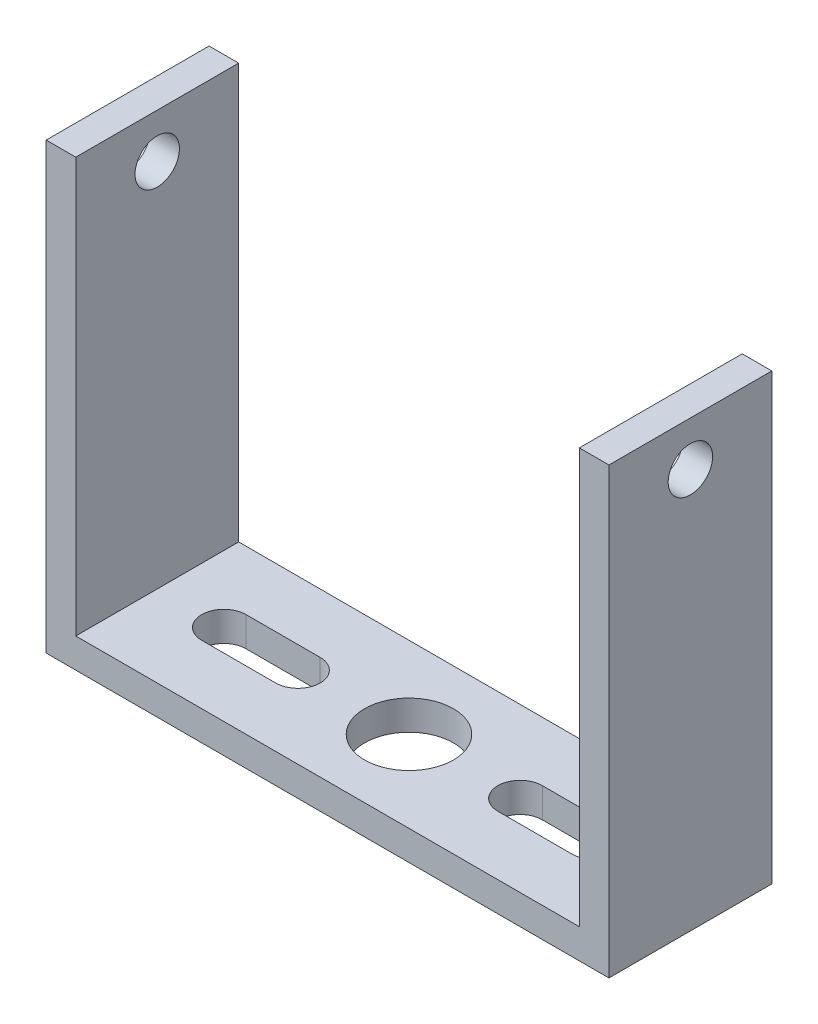
ISO-10303-21;
HEADER;
FILE_DESCRIPTION(('STEP AP214'),'2;1');
FILE_NAME('part.step','',(''),(''),'','','');
FILE_SCHEMA(('AUTOMOTIVE_DESIGN { 1 0 10303 214 1 1 1 1 }'));
ENDSEC;
DATA;
#1=APPLICATION_CONTEXT('core data for automotive mechanical design processes');
#2=APPLICATION_PROTOCOL_DEFINITION('international standard','automotive_design',2000,#1);
#3=PRODUCT_CONTEXT('',#1,'mechanical');
#4=PRODUCT('Part','Part','',(#3));
#5=PRODUCT_RELATED_PRODUCT_CATEGORY('part','',(#4));
#6=PRODUCT_DEFINITION_FORMATION('','',#4);
#7=PRODUCT_DEFINITION_CONTEXT('part definition',#1,'design');
#8=PRODUCT_DEFINITION('design','',#6,#7);
#9=PRODUCT_DEFINITION_SHAPE('','',#8);
#10=(LENGTH_UNIT() NAMED_UNIT(*) SI_UNIT(.MILLI.,.METRE.));
#11=(NAMED_UNIT(*) PLANE_ANGLE_UNIT() SI_UNIT($,.RADIAN.));
#12=(NAMED_UNIT(*) SI_UNIT($,.STERADIAN.) SOLID_ANGLE_UNIT());
#13=UNCERTAINTY_MEASURE_WITH_UNIT(LENGTH_MEASURE(1.E-05),#10,'distance_accuracy_value','');
#14=(GEOMETRIC_REPRESENTATION_CONTEXT(3) GLOBAL_UNCERTAINTY_ASSIGNED_CONTEXT((#13)) GLOBAL_UNIT_ASSIGNED_CONTEXT((#10,
#11,#12)) REPRESENTATION_CONTEXT('',''));
#15=CARTESIAN_POINT('',(0.,0.,0.));
#16=DIRECTION('',(0.,0.,1.));
#17=DIRECTION('',(1.,0.,0.));
#18=AXIS2_PLACEMENT_3D('',#15,#16,#17);
#19=CARTESIAN_POINT('',(2.00000000000001,30.,11.));
#20=DIRECTION('',(0.,-1.,0.));
#21=DIRECTION('',(1.,0.,0.));
#22=AXIS2_PLACEMENT_3D('',#19,#20,#21);
#23=PLANE('',#22);
#24=DIRECTION('',(-1.,0.,0.));
#25=VECTOR('',#24,1.);
#26=CARTESIAN_POINT('',(2.00000000000001,30.,0.));
#27=LINE('',#26,#25);
#28=CARTESIAN_POINT('',(2.00000000000001,30.,0.));
#29=VERTEX_POINT('',#28);
#30=CARTESIAN_POINT('',(0.,30.,0.));
#31=VERTEX_POINT('',#30);
#32=EDGE_CURVE('E212',#29,#31,#27,.T.);
#33=ORIENTED_EDGE('',*,*,#32,.T.);
#34=DIRECTION('',(0.,0.,-1.));
#35=VECTOR('',#34,1.);
#36=CARTESIAN_POINT('',(0.,30.,11.));
#37=LINE('',#36,#35);
#38=CARTESIAN_POINT('',(0.,30.,11.));
#39=VERTEX_POINT('',#38);
#40=EDGE_CURVE('E267',#39,#31,#37,.T.);
#41=ORIENTED_EDGE('',*,*,#40,.F.);
#42=DIRECTION('',(-1.,0.,0.));
#43=VECTOR('',#42,1.);
#44=CARTESIAN_POINT('',(2.00000000000001,30.,11.));
#45=LINE('',#44,#43);
#46=CARTESIAN_POINT('',(2.00000000000001,30.,11.));
#47=VERTEX_POINT('',#46);
#48=EDGE_CURVE('E213',#47,#39,#45,.T.);
#49=ORIENTED_EDGE('',*,*,#48,.F.);
#50=DIRECTION('',(0.,0.,-1.));
#51=VECTOR('',#50,1.);
#52=CARTESIAN_POINT('',(2.00000000000001,30.,11.));
#53=LINE('',#52,#51);
#54=EDGE_CURVE('E231',#47,#29,#53,.T.);
#55=ORIENTED_EDGE('',*,*,#54,.T.);
#56=EDGE_LOOP('',(#33,#41,#49,#55));
#57=FACE_BOUND('',#56,.T.);
#58=ADVANCED_FACE('F35',(#57),#23,.F.);
#59=CARTESIAN_POINT('',(0.,30.,11.));
#60=DIRECTION('',(1.,0.,0.));
#61=DIRECTION('',(0.,1.,0.));
#62=AXIS2_PLACEMENT_3D('',#59,#60,#61);
#63=PLANE('',#62);
#64=CARTESIAN_POINT('',(0.,27.,5.5));
#65=DIRECTION('',(1.,0.,0.));
#66=DIRECTION('',(0.,1.,0.));
#67=AXIS2_PLACEMENT_3D('',#64,#65,#66);
#68=CIRCLE('',#67,1.5);
#69=CARTESIAN_POINT('',(0.,28.5,5.5));
#70=VERTEX_POINT('',#69);
#71=EDGE_CURVE('E209',#70,#70,#68,.T.);
#72=ORIENTED_EDGE('',*,*,#71,.T.);
#73=EDGE_LOOP('',(#72));
#74=FACE_BOUND('',#73,.T.);
#75=DIRECTION('',(0.,-1.,0.));
#76=VECTOR('',#75,1.);
#77=CARTESIAN_POINT('',(0.,30.,0.));
#78=LINE('',#77,#76);
#79=CARTESIAN_POINT('',(0.,0.,0.));
#80=VERTEX_POINT('',#79);
#81=EDGE_CURVE('E234',#31,#80,#78,.T.);
#82=ORIENTED_EDGE('',*,*,#81,.T.);
#83=DIRECTION('',(0.,0.,-1.));
#84=VECTOR('',#83,1.);
#85=CARTESIAN_POINT('',(0.,0.,11.));
#86=LINE('',#85,#84);
#87=CARTESIAN_POINT('',(0.,0.,11.));
#88=VERTEX_POINT('',#87);
#89=EDGE_CURVE('E264',#88,#80,#86,.T.);
#90=ORIENTED_EDGE('',*,*,#89,.F.);
#91=DIRECTION('',(0.,-1.,0.));
#92=VECTOR('',#91,1.);
#93=CARTESIAN_POINT('',(0.,30.,11.));
#94=LINE('',#93,#92);
#95=EDGE_CURVE('E216',#39,#88,#94,.T.);
#96=ORIENTED_EDGE('',*,*,#95,.F.);
#97=ORIENTED_EDGE('',*,*,#40,.T.);
#98=EDGE_LOOP('',(#82,#90,#96,#97));
#99=FACE_BOUND('',#98,.T.);
#100=ADVANCED_FACE('F317',(#74,#99),#63,.F.);
#101=CARTESIAN_POINT('',(0.,0.,11.));
#102=DIRECTION('',(0.,1.,0.));
#103=DIRECTION('',(0.,0.,1.));
#104=AXIS2_PLACEMENT_3D('',#101,#102,#103);
#105=PLANE('',#104);
#106=DIRECTION('',(1.,0.,0.));
#107=VECTOR('',#106,1.);
#108=CARTESIAN_POINT('',(6.5,0.,4.));
#109=LINE('',#108,#107);
#110=CARTESIAN_POINT('',(6.5,0.,4.));
#111=VERTEX_POINT('',#110);
#112=CARTESIAN_POINT('',(11.5,0.,4.));
#113=VERTEX_POINT('',#112);
#114=EDGE_CURVE('E182',#111,#113,#109,.T.);
#115=ORIENTED_EDGE('',*,*,#114,.F.);
#116=CARTESIAN_POINT('',(6.5,0.,5.5));
#117=DIRECTION('',(0.,-1.,0.));
#118=DIRECTION('',(0.,0.,-1.));
#119=AXIS2_PLACEMENT_3D('',#116,#117,#118);
#120=CIRCLE('',#119,1.5);
#121=CARTESIAN_POINT('',(6.5,0.,7.));
#122=VERTEX_POINT('',#121);
#123=EDGE_CURVE('E49',#122,#111,#120,.T.);
#124=ORIENTED_EDGE('',*,*,#123,.F.);
#125=DIRECTION('',(-1.,0.,0.));
#126=VECTOR('',#125,1.);
#127=CARTESIAN_POINT('',(6.5,0.,7.));
#128=LINE('',#127,#126);
#129=CARTESIAN_POINT('',(11.5,0.,7.));
#130=VERTEX_POINT('',#129);
#131=EDGE_CURVE('E188',#130,#122,#128,.T.);
#132=ORIENTED_EDGE('',*,*,#131,.F.);
#133=CARTESIAN_POINT('',(11.5,0.,5.5));
#134=DIRECTION('',(0.,-1.,0.));
#135=DIRECTION('',(0.,0.,-1.));
#136=AXIS2_PLACEMENT_3D('',#133,#134,#135);
#137=CIRCLE('',#136,1.5);
#138=EDGE_CURVE('E185',#113,#130,#137,.T.);
#139=ORIENTED_EDGE('',*,*,#138,.F.);
#140=EDGE_LOOP('',(#115,#124,#132,#139));
#141=FACE_BOUND('',#140,.T.);
#142=DIRECTION('',(1.,0.,0.));
#143=VECTOR('',#142,1.);
#144=CARTESIAN_POINT('',(26.5,0.,4.));
#145=LINE('',#144,#143);
#146=CARTESIAN_POINT('',(26.5,0.,4.));
#147=VERTEX_POINT('',#146);
#148=CARTESIAN_POINT('',(31.5,0.,4.));
#149=VERTEX_POINT('',#148);
#150=EDGE_CURVE('E164',#147,#149,#145,.T.);
#151=ORIENTED_EDGE('',*,*,#150,.F.);
#152=CARTESIAN_POINT('',(26.5,0.,5.5));
#153=DIRECTION('',(0.,-1.,0.));
#154=DIRECTION('',(0.,0.,-1.));
#155=AXIS2_PLACEMENT_3D('',#152,#153,#154);
#156=CIRCLE('',#155,1.5);
#157=CARTESIAN_POINT('',(26.5,0.,7.));
#158=VERTEX_POINT('',#157);
#159=EDGE_CURVE('E57',#158,#147,#156,.T.);
#160=ORIENTED_EDGE('',*,*,#159,.F.);
#161=DIRECTION('',(-1.,0.,0.));
#162=VECTOR('',#161,1.);
#163=CARTESIAN_POINT('',(26.5,0.,7.));
#164=LINE('',#163,#162);
#165=CARTESIAN_POINT('',(31.5,0.,7.));
#166=VERTEX_POINT('',#165);
#167=EDGE_CURVE('E171',#166,#158,#164,.T.);
#168=ORIENTED_EDGE('',*,*,#167,.F.);
#169=CARTESIAN_POINT('',(31.5,0.,5.5));
#170=DIRECTION('',(0.,-1.,0.));
#171=DIRECTION('',(0.,0.,-1.));
#172=AXIS2_PLACEMENT_3D('',#169,#170,#171);
#173=CIRCLE('',#172,1.5);
#174=EDGE_CURVE('E154',#149,#166,#173,.T.);
#175=ORIENTED_EDGE('',*,*,#174,.F.);
#176=EDGE_LOOP('',(#151,#160,#168,#175));
#177=FACE_BOUND('',#176,.T.);
#178=CARTESIAN_POINT('',(19.,0.,5.5));
#179=DIRECTION('',(0.,-1.,0.));
#180=DIRECTION('',(0.,0.,-1.));
#181=AXIS2_PLACEMENT_3D('',#178,#179,#180);
#182=CIRCLE('',#181,3.);
#183=CARTESIAN_POINT('',(19.,0.,2.5));
#184=VERTEX_POINT('',#183);
#185=EDGE_CURVE('E178',#184,#184,#182,.T.);
#186=ORIENTED_EDGE('',*,*,#185,.F.);
#187=EDGE_LOOP('',(#186));
#188=FACE_BOUND('',#187,.T.);
#189=DIRECTION('',(1.,0.,0.));
#190=VECTOR('',#189,1.);
#191=CARTESIAN_POINT('',(0.,0.,0.));
#192=LINE('',#191,#190);
#193=CARTESIAN_POINT('',(38.,0.,0.));
#194=VERTEX_POINT('',#193);
#195=EDGE_CURVE('E236',#80,#194,#192,.T.);
#196=ORIENTED_EDGE('',*,*,#195,.T.);
#197=DIRECTION('',(0.,0.,-1.));
#198=VECTOR('',#197,1.);
#199=CARTESIAN_POINT('',(38.,0.,11.));
#200=LINE('',#199,#198);
#201=CARTESIAN_POINT('',(38.,0.,11.));
#202=VERTEX_POINT('',#201);
#203=EDGE_CURVE('E261',#202,#194,#200,.T.);
#204=ORIENTED_EDGE('',*,*,#203,.F.);
#205=DIRECTION('',(1.,0.,0.));
#206=VECTOR('',#205,1.);
#207=CARTESIAN_POINT('',(0.,0.,11.));
#208=LINE('',#207,#206);
#209=EDGE_CURVE('E219',#88,#202,#208,.T.);
#210=ORIENTED_EDGE('',*,*,#209,.F.);
#211=ORIENTED_EDGE('',*,*,#89,.T.);
#212=EDGE_LOOP('',(#196,#204,#210,#211));
#213=FACE_BOUND('',#212,.T.);
#214=ADVANCED_FACE('F168',(#141,#177,#188,#213),#105,.F.);
#215=CARTESIAN_POINT('',(38.,0.,11.));
#216=DIRECTION('',(-1.,0.,0.));
#217=DIRECTION('',(0.,0.,1.));
#218=AXIS2_PLACEMENT_3D('',#215,#216,#217);
#219=PLANE('',#218);
#220=CARTESIAN_POINT('',(38.,27.,5.5));
#221=DIRECTION('',(-1.,0.,0.));
#222=DIRECTION('',(0.,-1.,0.));
#223=AXIS2_PLACEMENT_3D('',#220,#221,#222);
#224=CIRCLE('',#223,1.5);
#225=CARTESIAN_POINT('',(38.,25.5,5.5));
#226=VERTEX_POINT('',#225);
#227=EDGE_CURVE('E202',#226,#226,#224,.T.);
#228=ORIENTED_EDGE('',*,*,#227,.T.);
#229=EDGE_LOOP('',(#228));
#230=FACE_BOUND('',#229,.T.);
#231=DIRECTION('',(0.,1.,0.));
#232=VECTOR('',#231,1.);
#233=CARTESIAN_POINT('',(38.,0.,0.));
#234=LINE('',#233,#232);
#235=CARTESIAN_POINT('',(38.,30.,0.));
#236=VERTEX_POINT('',#235);
#237=EDGE_CURVE('E238',#194,#236,#234,.T.);
#238=ORIENTED_EDGE('',*,*,#237,.T.);
#239=DIRECTION('',(0.,0.,-1.));
#240=VECTOR('',#239,1.);
#241=CARTESIAN_POINT('',(38.,30.,11.));
#242=LINE('',#241,#240);
#243=CARTESIAN_POINT('',(38.,30.,11.));
#244=VERTEX_POINT('',#243);
#245=EDGE_CURVE('E258',#244,#236,#242,.T.);
#246=ORIENTED_EDGE('',*,*,#245,.F.);
#247=DIRECTION('',(0.,1.,0.));
#248=VECTOR('',#247,1.);
#249=CARTESIAN_POINT('',(38.,0.,11.));
#250=LINE('',#249,#248);
#251=EDGE_CURVE('E221',#202,#244,#250,.T.);
#252=ORIENTED_EDGE('',*,*,#251,.F.);
#253=ORIENTED_EDGE('',*,*,#203,.T.);
#254=EDGE_LOOP('',(#238,#246,#252,#253));
#255=FACE_BOUND('',#254,.T.);
#256=ADVANCED_FACE('F357',(#230,#255),#219,.F.);
#257=CARTESIAN_POINT('',(38.,30.,11.));
#258=DIRECTION('',(0.,-1.,0.));
#259=DIRECTION('',(0.,0.,-1.));
#260=AXIS2_PLACEMENT_3D('',#257,#258,#259);
#261=PLANE('',#260);
#262=DIRECTION('',(-1.,0.,0.));
#263=VECTOR('',#262,1.);
#264=CARTESIAN_POINT('',(38.,30.,0.));
#265=LINE('',#264,#263);
#266=CARTESIAN_POINT('',(36.,30.,0.));
#267=VERTEX_POINT('',#266);
#268=EDGE_CURVE('E240',#236,#267,#265,.T.);
#269=ORIENTED_EDGE('',*,*,#268,.T.);
#270=DIRECTION('',(0.,0.,-1.));
#271=VECTOR('',#270,1.);
#272=CARTESIAN_POINT('',(36.,30.,11.));
#273=LINE('',#272,#271);
#274=CARTESIAN_POINT('',(36.,30.,11.));
#275=VERTEX_POINT('',#274);
#276=EDGE_CURVE('E255',#275,#267,#273,.T.);
#277=ORIENTED_EDGE('',*,*,#276,.F.);
#278=DIRECTION('',(-1.,0.,0.));
#279=VECTOR('',#278,1.);
#280=CARTESIAN_POINT('',(38.,30.,11.));
#281=LINE('',#280,#279);
#282=EDGE_CURVE('E223',#244,#275,#281,.T.);
#283=ORIENTED_EDGE('',*,*,#282,.F.);
#284=ORIENTED_EDGE('',*,*,#245,.T.);
#285=EDGE_LOOP('',(#269,#277,#283,#284));
#286=FACE_BOUND('',#285,.T.);
#287=ADVANCED_FACE('F353',(#286),#261,.F.);
#288=CARTESIAN_POINT('',(36.,30.,11.));
#289=DIRECTION('',(1.,0.,0.));
#290=DIRECTION('',(0.,0.,-1.));
#291=AXIS2_PLACEMENT_3D('',#288,#289,#290);
#292=PLANE('',#291);
#293=CARTESIAN_POINT('',(36.,27.,5.5));
#294=DIRECTION('',(1.,0.,0.));
#295=DIRECTION('',(0.,0.,-1.));
#296=AXIS2_PLACEMENT_3D('',#293,#294,#295);
#297=CIRCLE('',#296,1.5);
#298=CARTESIAN_POINT('',(36.,27.,4.));
#299=VERTEX_POINT('',#298);
#300=EDGE_CURVE('E206',#299,#299,#297,.T.);
#301=ORIENTED_EDGE('',*,*,#300,.T.);
#302=EDGE_LOOP('',(#301));
#303=FACE_BOUND('',#302,.T.);
#304=DIRECTION('',(0.,-1.,0.));
#305=VECTOR('',#304,1.);
#306=CARTESIAN_POINT('',(36.,30.,0.));
#307=LINE('',#306,#305);
#308=CARTESIAN_POINT('',(36.,2.,0.));
#309=VERTEX_POINT('',#308);
#310=EDGE_CURVE('E242',#267,#309,#307,.T.);
#311=ORIENTED_EDGE('',*,*,#310,.T.);
#312=DIRECTION('',(0.,0.,-1.));
#313=VECTOR('',#312,1.);
#314=CARTESIAN_POINT('',(36.,2.,11.));
#315=LINE('',#314,#313);
#316=CARTESIAN_POINT('',(36.,2.,11.));
#317=VERTEX_POINT('',#316);
#318=EDGE_CURVE('E252',#317,#309,#315,.T.);
#319=ORIENTED_EDGE('',*,*,#318,.F.);
#320=DIRECTION('',(0.,-1.,0.));
#321=VECTOR('',#320,1.);
#322=CARTESIAN_POINT('',(36.,30.,11.));
#323=LINE('',#322,#321);
#324=EDGE_CURVE('E225',#275,#317,#323,.T.);
#325=ORIENTED_EDGE('',*,*,#324,.F.);
#326=ORIENTED_EDGE('',*,*,#276,.T.);
#327=EDGE_LOOP('',(#311,#319,#325,#326));
#328=FACE_BOUND('',#327,.T.);
#329=ADVANCED_FACE('F348',(#303,#328),#292,.F.);
#330=CARTESIAN_POINT('',(36.,2.,11.));
#331=DIRECTION('',(0.,-1.,0.));
#332=DIRECTION('',(1.,0.,0.));
#333=AXIS2_PLACEMENT_3D('',#330,#331,#332);
#334=PLANE('',#333);
#335=DIRECTION('',(-1.,0.,0.));
#336=VECTOR('',#335,1.);
#337=CARTESIAN_POINT('',(36.,2.,7.));
#338=LINE('',#337,#336);
#339=CARTESIAN_POINT('',(11.5,2.,7.));
#340=VERTEX_POINT('',#339);
#341=CARTESIAN_POINT('',(6.5,2.,7.));
#342=VERTEX_POINT('',#341);
#343=EDGE_CURVE('E42',#340,#342,#338,.T.);
#344=ORIENTED_EDGE('',*,*,#343,.T.);
#345=CARTESIAN_POINT('',(6.5,2.,5.5));
#346=DIRECTION('',(0.,-1.,0.));
#347=DIRECTION('',(1.,0.,0.));
#348=AXIS2_PLACEMENT_3D('',#345,#346,#347);
#349=CIRCLE('',#348,1.5);
#350=CARTESIAN_POINT('',(6.5,2.,4.));
#351=VERTEX_POINT('',#350);
#352=EDGE_CURVE('E11',#342,#351,#349,.T.);
#353=ORIENTED_EDGE('',*,*,#352,.T.);
#354=DIRECTION('',(1.,0.,0.));
#355=VECTOR('',#354,1.);
#356=CARTESIAN_POINT('',(36.,2.,4.));
#357=LINE('',#356,#355);
#358=CARTESIAN_POINT('',(11.5,2.,4.));
#359=VERTEX_POINT('',#358);
#360=EDGE_CURVE('E283',#351,#359,#357,.T.);
#361=ORIENTED_EDGE('',*,*,#360,.T.);
#362=CARTESIAN_POINT('',(11.5,2.,5.5));
#363=DIRECTION('',(0.,-1.,0.));
#364=DIRECTION('',(1.,0.,0.));
#365=AXIS2_PLACEMENT_3D('',#362,#363,#364);
#366=CIRCLE('',#365,1.5);
#367=EDGE_CURVE('E286',#359,#340,#366,.T.);
#368=ORIENTED_EDGE('',*,*,#367,.T.);
#369=EDGE_LOOP('',(#344,#353,#361,#368));
#370=FACE_BOUND('',#369,.T.);
#371=DIRECTION('',(-1.,0.,0.));
#372=VECTOR('',#371,1.);
#373=CARTESIAN_POINT('',(36.,2.,7.));
#374=LINE('',#373,#372);
#375=CARTESIAN_POINT('',(31.5,2.,7.));
#376=VERTEX_POINT('',#375);
#377=CARTESIAN_POINT('',(26.5,2.,7.));
#378=VERTEX_POINT('',#377);
#379=EDGE_CURVE('E277',#376,#378,#374,.T.);
#380=ORIENTED_EDGE('',*,*,#379,.T.);
#381=CARTESIAN_POINT('',(26.5,2.,5.5));
#382=DIRECTION('',(0.,-1.,0.));
#383=DIRECTION('',(1.,0.,0.));
#384=AXIS2_PLACEMENT_3D('',#381,#382,#383);
#385=CIRCLE('',#384,1.5);
#386=CARTESIAN_POINT('',(26.5,2.,4.));
#387=VERTEX_POINT('',#386);
#388=EDGE_CURVE('E280',#378,#387,#385,.T.);
#389=ORIENTED_EDGE('',*,*,#388,.T.);
#390=DIRECTION('',(1.,0.,0.));
#391=VECTOR('',#390,1.);
#392=CARTESIAN_POINT('',(36.,2.,4.));
#393=LINE('',#392,#391);
#394=CARTESIAN_POINT('',(31.5,2.,4.));
#395=VERTEX_POINT('',#394);
#396=EDGE_CURVE('E270',#387,#395,#393,.T.);
#397=ORIENTED_EDGE('',*,*,#396,.T.);
#398=CARTESIAN_POINT('',(31.5,2.,5.5));
#399=DIRECTION('',(0.,-1.,0.));
#400=DIRECTION('',(1.,0.,0.));
#401=AXIS2_PLACEMENT_3D('',#398,#399,#400);
#402=CIRCLE('',#401,1.5);
#403=EDGE_CURVE('E157',#395,#376,#402,.T.);
#404=ORIENTED_EDGE('',*,*,#403,.T.);
#405=EDGE_LOOP('',(#380,#389,#397,#404));
#406=FACE_BOUND('',#405,.T.);
#407=CARTESIAN_POINT('',(19.,2.,5.5));
#408=DIRECTION('',(0.,-1.,0.));
#409=DIRECTION('',(1.,0.,0.));
#410=AXIS2_PLACEMENT_3D('',#407,#408,#409);
#411=CIRCLE('',#410,3.);
#412=CARTESIAN_POINT('',(22.,2.,5.5));
#413=VERTEX_POINT('',#412);
#414=EDGE_CURVE('E201',#413,#413,#411,.T.);
#415=ORIENTED_EDGE('',*,*,#414,.T.);
#416=EDGE_LOOP('',(#415));
#417=FACE_BOUND('',#416,.T.);
#418=DIRECTION('',(-1.,0.,0.));
#419=VECTOR('',#418,1.);
#420=CARTESIAN_POINT('',(36.,2.,0.));
#421=LINE('',#420,#419);
#422=CARTESIAN_POINT('',(2.00000000000001,2.,0.));
#423=VERTEX_POINT('',#422);
#424=EDGE_CURVE('E244',#309,#423,#421,.T.);
#425=ORIENTED_EDGE('',*,*,#424,.T.);
#426=DIRECTION('',(0.,0.,-1.));
#427=VECTOR('',#426,1.);
#428=CARTESIAN_POINT('',(2.00000000000001,2.,11.));
#429=LINE('',#428,#427);
#430=CARTESIAN_POINT('',(2.00000000000001,2.,11.));
#431=VERTEX_POINT('',#430);
#432=EDGE_CURVE('E249',#431,#423,#429,.T.);
#433=ORIENTED_EDGE('',*,*,#432,.F.);
#434=DIRECTION('',(-1.,0.,0.));
#435=VECTOR('',#434,1.);
#436=CARTESIAN_POINT('',(36.,2.,11.));
#437=LINE('',#436,#435);
#438=EDGE_CURVE('E227',#317,#431,#437,.T.);
#439=ORIENTED_EDGE('',*,*,#438,.F.);
#440=ORIENTED_EDGE('',*,*,#318,.T.);
#441=EDGE_LOOP('',(#425,#433,#439,#440));
#442=FACE_BOUND('',#441,.T.);
#443=ADVANCED_FACE('F290',(#370,#406,#417,#442),#334,.F.);
#444=CARTESIAN_POINT('',(2.00000000000001,2.,11.));
#445=DIRECTION('',(-1.,0.,0.));
#446=DIRECTION('',(0.,0.,1.));
#447=AXIS2_PLACEMENT_3D('',#444,#445,#446);
#448=PLANE('',#447);
#449=CARTESIAN_POINT('',(2.00000000000001,27.,5.5));
#450=DIRECTION('',(-1.,0.,0.));
#451=DIRECTION('',(0.,0.,1.));
#452=AXIS2_PLACEMENT_3D('',#449,#450,#451);
#453=CIRCLE('',#452,1.5);
#454=CARTESIAN_POINT('',(2.00000000000001,27.,7.));
#455=VERTEX_POINT('',#454);
#456=EDGE_CURVE('E205',#455,#455,#453,.T.);
#457=ORIENTED_EDGE('',*,*,#456,.T.);
#458=EDGE_LOOP('',(#457));
#459=FACE_BOUND('',#458,.T.);
#460=DIRECTION('',(0.,1.,0.));
#461=VECTOR('',#460,1.);
#462=CARTESIAN_POINT('',(2.00000000000001,2.,0.));
#463=LINE('',#462,#461);
#464=EDGE_CURVE('E217',#423,#29,#463,.T.);
#465=ORIENTED_EDGE('',*,*,#464,.T.);
#466=ORIENTED_EDGE('',*,*,#54,.F.);
#467=DIRECTION('',(0.,1.,0.));
#468=VECTOR('',#467,1.);
#469=CARTESIAN_POINT('',(2.00000000000001,2.,11.));
#470=LINE('',#469,#468);
#471=EDGE_CURVE('E229',#431,#47,#470,.T.);
#472=ORIENTED_EDGE('',*,*,#471,.F.);
#473=ORIENTED_EDGE('',*,*,#432,.T.);
#474=EDGE_LOOP('',(#465,#466,#472,#473));
#475=FACE_BOUND('',#474,.T.);
#476=ADVANCED_FACE('F342',(#459,#475),#448,.F.);
#477=CARTESIAN_POINT('',(0.,0.,11.));
#478=DIRECTION('',(0.,0.,1.));
#479=DIRECTION('',(1.,0.,0.));
#480=AXIS2_PLACEMENT_3D('',#477,#478,#479);
#481=PLANE('',#480);
#482=ORIENTED_EDGE('',*,*,#48,.T.);
#483=ORIENTED_EDGE('',*,*,#95,.T.);
#484=ORIENTED_EDGE('',*,*,#209,.T.);
#485=ORIENTED_EDGE('',*,*,#251,.T.);
#486=ORIENTED_EDGE('',*,*,#282,.T.);
#487=ORIENTED_EDGE('',*,*,#324,.T.);
#488=ORIENTED_EDGE('',*,*,#438,.T.);
#489=ORIENTED_EDGE('',*,*,#471,.T.);
#490=EDGE_LOOP('',(#482,#483,#484,#485,#486,#487,#488,#489));
#491=FACE_BOUND('',#490,.T.);
#492=ADVANCED_FACE('F337',(#491),#481,.T.);
#493=CARTESIAN_POINT('',(0.,0.,0.));
#494=DIRECTION('',(0.,0.,1.));
#495=DIRECTION('',(1.,0.,0.));
#496=AXIS2_PLACEMENT_3D('',#493,#494,#495);
#497=PLANE('',#496);
#498=ORIENTED_EDGE('',*,*,#32,.F.);
#499=ORIENTED_EDGE('',*,*,#464,.F.);
#500=ORIENTED_EDGE('',*,*,#424,.F.);
#501=ORIENTED_EDGE('',*,*,#310,.F.);
#502=ORIENTED_EDGE('',*,*,#268,.F.);
#503=ORIENTED_EDGE('',*,*,#237,.F.);
#504=ORIENTED_EDGE('',*,*,#195,.F.);
#505=ORIENTED_EDGE('',*,*,#81,.F.);
#506=EDGE_LOOP('',(#498,#499,#500,#501,#502,#503,#504,#505));
#507=FACE_BOUND('',#506,.T.);
#508=ADVANCED_FACE('F329',(#507),#497,.F.);
#509=CARTESIAN_POINT('',(38.,27.,5.5));
#510=DIRECTION('',(-1.,0.,0.));
#511=DIRECTION('',(0.,-1.,0.));
#512=AXIS2_PLACEMENT_3D('',#509,#510,#511);
#513=CYLINDRICAL_SURFACE('',#512,1.5);
#514=ORIENTED_EDGE('',*,*,#456,.F.);
#515=EDGE_LOOP('',(#514));
#516=FACE_BOUND('',#515,.T.);
#517=ORIENTED_EDGE('',*,*,#71,.F.);
#518=EDGE_LOOP('',(#517));
#519=FACE_BOUND('',#518,.T.);
#520=ADVANCED_FACE('F380',(#516,#519),#513,.F.);
#521=ORIENTED_EDGE('',*,*,#227,.F.);
#522=EDGE_LOOP('',(#521));
#523=FACE_BOUND('',#522,.T.);
#524=ORIENTED_EDGE('',*,*,#300,.F.);
#525=EDGE_LOOP('',(#524));
#526=FACE_BOUND('',#525,.T.);
#527=ADVANCED_FACE('F384',(#523,#526),#513,.F.);
#528=CARTESIAN_POINT('',(19.,3.,5.5));
#529=DIRECTION('',(0.,-1.,0.));
#530=DIRECTION('',(0.,0.,-1.));
#531=AXIS2_PLACEMENT_3D('',#528,#529,#530);
#532=CYLINDRICAL_SURFACE('',#531,3.);
#533=ORIENTED_EDGE('',*,*,#185,.T.);
#534=EDGE_LOOP('',(#533));
#535=FACE_BOUND('',#534,.T.);
#536=ORIENTED_EDGE('',*,*,#414,.F.);
#537=EDGE_LOOP('',(#536));
#538=FACE_BOUND('',#537,.T.);
#539=ADVANCED_FACE('F386',(#535,#538),#532,.F.);
#540=CARTESIAN_POINT('',(26.5,3.,5.5));
#541=DIRECTION('',(0.,-1.,0.));
#542=DIRECTION('',(0.,0.,-1.));
#543=AXIS2_PLACEMENT_3D('',#540,#541,#542);
#544=CYLINDRICAL_SURFACE('',#543,1.5);
#545=DIRECTION('',(0.,-1.,0.));
#546=VECTOR('',#545,1.);
#547=CARTESIAN_POINT('',(26.5,3.,7.));
#548=LINE('',#547,#546);
#549=EDGE_CURVE('E176',#378,#158,#548,.T.);
#550=ORIENTED_EDGE('',*,*,#549,.T.);
#551=ORIENTED_EDGE('',*,*,#159,.T.);
#552=DIRECTION('',(0.,-1.,0.));
#553=VECTOR('',#552,1.);
#554=CARTESIAN_POINT('',(26.5,3.,4.));
#555=LINE('',#554,#553);
#556=EDGE_CURVE('E161',#387,#147,#555,.T.);
#557=ORIENTED_EDGE('',*,*,#556,.F.);
#558=ORIENTED_EDGE('',*,*,#388,.F.);
#559=EDGE_LOOP('',(#550,#551,#557,#558));
#560=FACE_BOUND('',#559,.T.);
#561=ADVANCED_FACE('F388',(#560),#544,.F.);
#562=CARTESIAN_POINT('',(26.5,3.,7.));
#563=DIRECTION('',(0.,0.,1.));
#564=DIRECTION('',(1.,0.,0.));
#565=AXIS2_PLACEMENT_3D('',#562,#563,#564);
#566=PLANE('',#565);
#567=DIRECTION('',(0.,-1.,0.));
#568=VECTOR('',#567,1.);
#569=CARTESIAN_POINT('',(31.5,3.,7.));
#570=LINE('',#569,#568);
#571=EDGE_CURVE('E160',#376,#166,#570,.T.);
#572=ORIENTED_EDGE('',*,*,#571,.T.);
#573=ORIENTED_EDGE('',*,*,#167,.T.);
#574=ORIENTED_EDGE('',*,*,#549,.F.);
#575=ORIENTED_EDGE('',*,*,#379,.F.);
#576=EDGE_LOOP('',(#572,#573,#574,#575));
#577=FACE_BOUND('',#576,.T.);
#578=ADVANCED_FACE('F394',(#577),#566,.F.);
#579=CARTESIAN_POINT('',(31.5,3.,5.5));
#580=DIRECTION('',(0.,-1.,0.));
#581=DIRECTION('',(0.,0.,-1.));
#582=AXIS2_PLACEMENT_3D('',#579,#580,#581);
#583=CYLINDRICAL_SURFACE('',#582,1.5);
#584=DIRECTION('',(0.,-1.,0.));
#585=VECTOR('',#584,1.);
#586=CARTESIAN_POINT('',(31.5,3.,4.));
#587=LINE('',#586,#585);
#588=EDGE_CURVE('E149',#395,#149,#587,.T.);
#589=ORIENTED_EDGE('',*,*,#588,.T.);
#590=ORIENTED_EDGE('',*,*,#174,.T.);
#591=ORIENTED_EDGE('',*,*,#571,.F.);
#592=ORIENTED_EDGE('',*,*,#403,.F.);
#593=EDGE_LOOP('',(#589,#590,#591,#592));
#594=FACE_BOUND('',#593,.T.);
#595=ADVANCED_FACE('F151',(#594),#583,.F.);
#596=CARTESIAN_POINT('',(26.5,3.,4.));
#597=DIRECTION('',(0.,0.,-1.));
#598=DIRECTION('',(-1.,0.,0.));
#599=AXIS2_PLACEMENT_3D('',#596,#597,#598);
#600=PLANE('',#599);
#601=ORIENTED_EDGE('',*,*,#556,.T.);
#602=ORIENTED_EDGE('',*,*,#150,.T.);
#603=ORIENTED_EDGE('',*,*,#588,.F.);
#604=ORIENTED_EDGE('',*,*,#396,.F.);
#605=EDGE_LOOP('',(#601,#602,#603,#604));
#606=FACE_BOUND('',#605,.T.);
#607=ADVANCED_FACE('F165',(#606),#600,.F.);
#608=CARTESIAN_POINT('',(6.5,3.,5.5));
#609=DIRECTION('',(0.,-1.,0.));
#610=DIRECTION('',(0.,0.,-1.));
#611=AXIS2_PLACEMENT_3D('',#608,#609,#610);
#612=CYLINDRICAL_SURFACE('',#611,1.5);
#613=DIRECTION('',(0.,-1.,0.));
#614=VECTOR('',#613,1.);
#615=CARTESIAN_POINT('',(6.5,3.,7.));
#616=LINE('',#615,#614);
#617=EDGE_CURVE('E192',#342,#122,#616,.T.);
#618=ORIENTED_EDGE('',*,*,#617,.T.);
#619=ORIENTED_EDGE('',*,*,#123,.T.);
#620=DIRECTION('',(0.,-1.,0.));
#621=VECTOR('',#620,1.);
#622=CARTESIAN_POINT('',(6.5,3.,4.));
#623=LINE('',#622,#621);
#624=EDGE_CURVE('E191',#351,#111,#623,.T.);
#625=ORIENTED_EDGE('',*,*,#624,.F.);
#626=ORIENTED_EDGE('',*,*,#352,.F.);
#627=EDGE_LOOP('',(#618,#619,#625,#626));
#628=FACE_BOUND('',#627,.T.);
#629=ADVANCED_FACE('F305',(#628),#612,.F.);
#630=CARTESIAN_POINT('',(6.5,3.,7.));
#631=DIRECTION('',(0.,0.,1.));
#632=DIRECTION('',(1.,0.,0.));
#633=AXIS2_PLACEMENT_3D('',#630,#631,#632);
#634=PLANE('',#633);
#635=DIRECTION('',(0.,-1.,0.));
#636=VECTOR('',#635,1.);
#637=CARTESIAN_POINT('',(11.5,3.,7.));
#638=LINE('',#637,#636);
#639=EDGE_CURVE('E194',#340,#130,#638,.T.);
#640=ORIENTED_EDGE('',*,*,#639,.T.);
#641=ORIENTED_EDGE('',*,*,#131,.T.);
#642=ORIENTED_EDGE('',*,*,#617,.F.);
#643=ORIENTED_EDGE('',*,*,#343,.F.);
#644=EDGE_LOOP('',(#640,#641,#642,#643));
#645=FACE_BOUND('',#644,.T.);
#646=ADVANCED_FACE('F296',(#645),#634,.F.);
#647=CARTESIAN_POINT('',(11.5,3.,5.5));
#648=DIRECTION('',(0.,-1.,0.));
#649=DIRECTION('',(0.,0.,-1.));
#650=AXIS2_PLACEMENT_3D('',#647,#648,#649);
#651=CYLINDRICAL_SURFACE('',#650,1.5);
#652=DIRECTION('',(0.,-1.,0.));
#653=VECTOR('',#652,1.);
#654=CARTESIAN_POINT('',(11.5,3.,4.));
#655=LINE('',#654,#653);
#656=EDGE_CURVE('E196',#359,#113,#655,.T.);
#657=ORIENTED_EDGE('',*,*,#656,.T.);
#658=ORIENTED_EDGE('',*,*,#138,.T.);
#659=ORIENTED_EDGE('',*,*,#639,.F.);
#660=ORIENTED_EDGE('',*,*,#367,.F.);
#661=EDGE_LOOP('',(#657,#658,#659,#660));
#662=FACE_BOUND('',#661,.T.);
#663=ADVANCED_FACE('F298',(#662),#651,.F.);
#664=CARTESIAN_POINT('',(6.5,3.,4.));
#665=DIRECTION('',(0.,0.,-1.));
#666=DIRECTION('',(-1.,0.,0.));
#667=AXIS2_PLACEMENT_3D('',#664,#665,#666);
#668=PLANE('',#667);
#669=ORIENTED_EDGE('',*,*,#624,.T.);
#670=ORIENTED_EDGE('',*,*,#114,.T.);
#671=ORIENTED_EDGE('',*,*,#656,.F.);
#672=ORIENTED_EDGE('',*,*,#360,.F.);
#673=EDGE_LOOP('',(#669,#670,#671,#672));
#674=FACE_BOUND('',#673,.T.);
#675=ADVANCED_FACE('F304',(#674),#668,.F.);
#676=CLOSED_SHELL('',(#58,#100,#214,#256,#287,#329,#443,#476,#492,#508,#520,#527,#539,#561,#578,
#595,#607,#629,#646,#663,#675));
#677=MANIFOLD_SOLID_BREP('B2',#676);
#678=ADVANCED_BREP_SHAPE_REPRESENTATION('',(#18,#677),#14);
#679=SHAPE_DEFINITION_REPRESENTATION(#9,#678);
ENDSEC;
END-ISO-10303-21;
